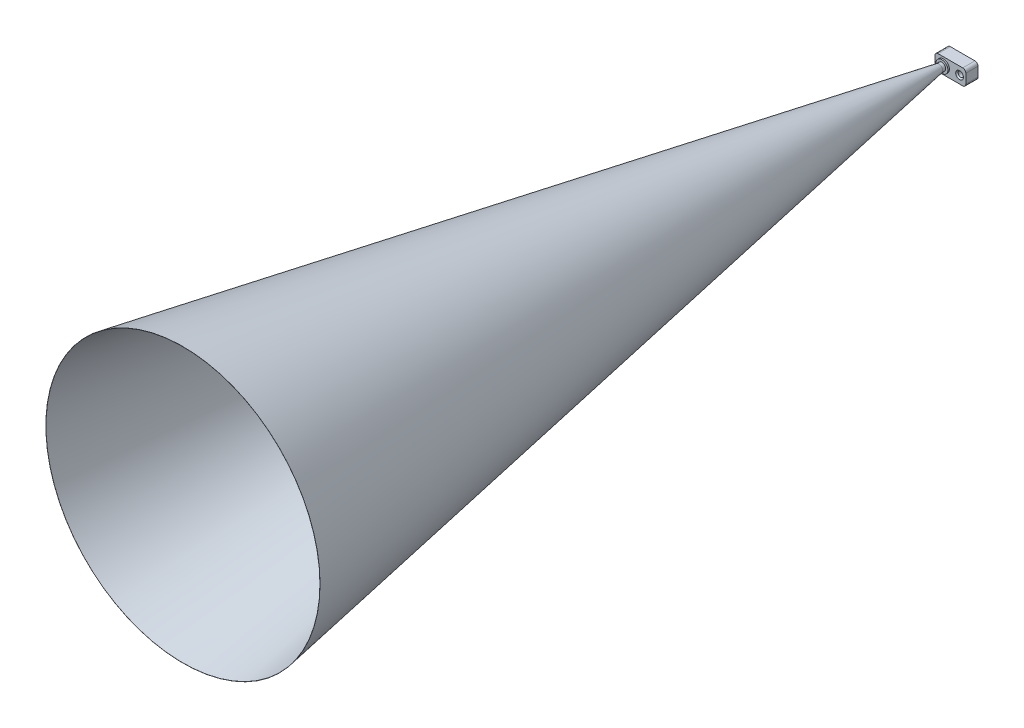
ISO-10303-21;
HEADER;
FILE_DESCRIPTION(('STEP AP214'),'2;1');
FILE_NAME('part.step','',(''),(''),'','','');
FILE_SCHEMA(('AUTOMOTIVE_DESIGN { 1 0 10303 214 1 1 1 1 }'));
ENDSEC;
DATA;
#1=APPLICATION_CONTEXT('core data for automotive mechanical design processes');
#2=APPLICATION_PROTOCOL_DEFINITION('international standard','automotive_design',2000,#1);
#3=PRODUCT_CONTEXT('',#1,'mechanical');
#4=PRODUCT('Part','Part','',(#3));
#5=PRODUCT_RELATED_PRODUCT_CATEGORY('part','',(#4));
#6=PRODUCT_DEFINITION_FORMATION('','',#4);
#7=PRODUCT_DEFINITION_CONTEXT('part definition',#1,'design');
#8=PRODUCT_DEFINITION('design','',#6,#7);
#9=PRODUCT_DEFINITION_SHAPE('','',#8);
#10=(LENGTH_UNIT() NAMED_UNIT(*) SI_UNIT(.MILLI.,.METRE.));
#11=(NAMED_UNIT(*) PLANE_ANGLE_UNIT() SI_UNIT($,.RADIAN.));
#12=(NAMED_UNIT(*) SI_UNIT($,.STERADIAN.) SOLID_ANGLE_UNIT());
#13=UNCERTAINTY_MEASURE_WITH_UNIT(LENGTH_MEASURE(1.E-05),#10,'distance_accuracy_value','');
#14=(GEOMETRIC_REPRESENTATION_CONTEXT(3) GLOBAL_UNCERTAINTY_ASSIGNED_CONTEXT((#13)) GLOBAL_UNIT_ASSIGNED_CONTEXT((#10,
#11,#12)) REPRESENTATION_CONTEXT('',''));
#15=CARTESIAN_POINT('',(0.,0.,0.));
#16=DIRECTION('',(0.,0.,1.));
#17=DIRECTION('',(1.,0.,0.));
#18=AXIS2_PLACEMENT_3D('',#15,#16,#17);
#19=CARTESIAN_POINT('',(7.90594809327857,5.08,10.8712));
#20=DIRECTION('',(0.,0.,1.));
#21=DIRECTION('',(1.,0.,0.));
#22=AXIS2_PLACEMENT_3D('',#19,#20,#21);
#23=PLANE('',#22);
#24=CARTESIAN_POINT('',(5.49999999999999,5.08,10.8712));
#25=DIRECTION('',(0.,0.,-1.));
#26=DIRECTION('',(-1.,0.,0.));
#27=AXIS2_PLACEMENT_3D('',#24,#25,#26);
#28=CIRCLE('',#27,2.40594809327857);
#29=CARTESIAN_POINT('',(7.90594809327857,5.08,10.8712));
#30=VERTEX_POINT('',#29);
#31=EDGE_CURVE('E75',#30,#30,#28,.T.);
#32=ORIENTED_EDGE('',*,*,#31,.F.);
#33=EDGE_LOOP('',(#32));
#34=FACE_BOUND('',#33,.T.);
#35=CARTESIAN_POINT('',(5.49999999999999,5.08,10.8712));
#36=DIRECTION('',(0.,0.,-1.));
#37=DIRECTION('',(-1.,0.,0.));
#38=AXIS2_PLACEMENT_3D('',#35,#36,#37);
#39=CIRCLE('',#38,2.4765);
#40=CARTESIAN_POINT('',(7.97649999999999,5.08,10.8712));
#41=VERTEX_POINT('',#40);
#42=EDGE_CURVE('E11',#41,#41,#39,.T.);
#43=ORIENTED_EDGE('',*,*,#42,.T.);
#44=EDGE_LOOP('',(#43));
#45=FACE_BOUND('',#44,.T.);
#46=ADVANCED_FACE('F59',(#34,#45),#23,.F.);
#47=CARTESIAN_POINT('',(5.49999999999999,5.08,503.275076506104));
#48=DIRECTION('',(0.,0.,1.));
#49=DIRECTION('',(1.,0.,0.));
#50=AXIS2_PLACEMENT_3D('',#47,#48,#49);
#51=CONICAL_SURFACE('',#50,89.3005888334657,0.174532925199434);
#52=CARTESIAN_POINT('',(5.49999999999999,5.08,503.275076506104));
#53=DIRECTION('',(0.,0.,-1.));
#54=DIRECTION('',(-1.,0.,0.));
#55=AXIS2_PLACEMENT_3D('',#52,#53,#54);
#56=CIRCLE('',#55,89.3005888334657);
#57=CARTESIAN_POINT('',(94.8005888334657,5.08,503.275076506104));
#58=VERTEX_POINT('',#57);
#59=EDGE_CURVE('E66',#58,#58,#56,.T.);
#60=CARTESIAN_POINT('',(7.97649999999999,5.08,10.8712));
#61=CARTESIAN_POINT('',(8.88091759201525,5.08,16.0004070469386));
#62=CARTESIAN_POINT('',(9.78533518403051,5.08,21.1296140938771));
#63=CARTESIAN_POINT('',(11.594170368061,5.08,31.3880281877543));
#64=CARTESIAN_POINT('',(12.4985879600763,5.08,36.5172352346929));
#65=CARTESIAN_POINT('',(14.3074231441068,5.08,46.77564932857));
#66=CARTESIAN_POINT('',(15.2118407361221,5.08,51.9048563755086));
#67=CARTESIAN_POINT('',(17.0206759201527,5.08,62.1632704693858));
#68=CARTESIAN_POINT('',(17.9250935121679,5.08,67.2924775163244));
#69=CARTESIAN_POINT('',(19.7339286961985,5.08,77.5508916102016));
#70=CARTESIAN_POINT('',(20.6383462882137,5.08,82.6800986571401));
#71=CARTESIAN_POINT('',(22.4471814722443,5.08,92.9385127510173));
#72=CARTESIAN_POINT('',(23.3515990642595,5.08,98.0677197979559));
#73=CARTESIAN_POINT('',(25.1604342482901,5.08,108.326133891833));
#74=CARTESIAN_POINT('',(26.0648518403053,5.08,113.455340938772));
#75=CARTESIAN_POINT('',(27.8736870243359,5.08,123.713755032649));
#76=CARTESIAN_POINT('',(28.7781046163511,5.08,128.842962079587));
#77=CARTESIAN_POINT('',(30.5869398003817,5.08,139.101376173465));
#78=CARTESIAN_POINT('',(31.4913573923969,5.08,144.230583220403));
#79=CARTESIAN_POINT('',(33.3001925764275,5.08,154.48899731428));
#80=CARTESIAN_POINT('',(34.2046101684427,5.08,159.618204361219));
#81=CARTESIAN_POINT('',(36.0134453524733,5.08,169.876618455096));
#82=CARTESIAN_POINT('',(36.9178629444885,5.08,175.005825502035));
#83=CARTESIAN_POINT('',(38.7266981285191,5.08,185.264239595912));
#84=CARTESIAN_POINT('',(39.6311157205343,5.08,190.39344664285));
#85=CARTESIAN_POINT('',(41.4399509045649,5.08,200.651860736728));
#86=CARTESIAN_POINT('',(42.3443684965801,5.08,205.781067783666));
#87=CARTESIAN_POINT('',(44.1532036806107,5.08,216.039481877543));
#88=CARTESIAN_POINT('',(45.057621272626,5.08,221.168688924482));
#89=CARTESIAN_POINT('',(46.8664564566565,5.08,231.427103018359));
#90=CARTESIAN_POINT('',(47.7708740486718,5.08,236.556310065298));
#91=CARTESIAN_POINT('',(49.5797092327023,5.08,246.814724159175));
#92=CARTESIAN_POINT('',(50.4841268247176,5.08,251.943931206113));
#93=CARTESIAN_POINT('',(52.2929620087481,5.08,262.202345299991));
#94=CARTESIAN_POINT('',(53.1973796007634,5.08,267.331552346929));
#95=CARTESIAN_POINT('',(55.0062147847939,5.08,277.589966440806));
#96=CARTESIAN_POINT('',(55.9106323768092,5.08,282.719173487745));
#97=CARTESIAN_POINT('',(57.7194675608397,5.08,292.977587581622));
#98=CARTESIAN_POINT('',(58.623885152855,5.08,298.106794628561));
#99=CARTESIAN_POINT('',(60.4327203368855,5.08,308.365208722438));
#100=CARTESIAN_POINT('',(61.3371379289008,5.08,313.494415769376));
#101=CARTESIAN_POINT('',(63.1459731129313,5.08,323.752829863254));
#102=CARTESIAN_POINT('',(64.0503907049466,5.08,328.882036910192));
#103=CARTESIAN_POINT('',(65.8592258889771,5.08,339.140451004069));
#104=CARTESIAN_POINT('',(66.7636434809924,5.08,344.269658051008));
#105=CARTESIAN_POINT('',(68.5724786650229,5.08,354.528072144885));
#106=CARTESIAN_POINT('',(69.4768962570382,5.08,359.657279191824));
#107=CARTESIAN_POINT('',(71.2857314410687,5.08,369.915693285701));
#108=CARTESIAN_POINT('',(72.190149033084,5.08,375.044900332639));
#109=CARTESIAN_POINT('',(73.9989842171145,5.08,385.303314426517));
#110=CARTESIAN_POINT('',(74.9034018091298,5.08,390.432521473455));
#111=CARTESIAN_POINT('',(76.7122369931603,5.08,400.690935567332));
#112=CARTESIAN_POINT('',(77.6166545851756,5.08,405.820142614271));
#113=CARTESIAN_POINT('',(79.4254897692061,5.08,416.078556708148));
#114=CARTESIAN_POINT('',(80.3299073612214,5.08,421.207763755087));
#115=CARTESIAN_POINT('',(82.1387425452519,5.08,431.466177848964));
#116=CARTESIAN_POINT('',(83.0431601372672,5.08,436.595384895902));
#117=CARTESIAN_POINT('',(84.8519953212977,5.08,446.85379898978));
#118=CARTESIAN_POINT('',(85.756412913313,5.08,451.983006036718));
#119=CARTESIAN_POINT('',(87.5652480973435,5.08,462.241420130595));
#120=CARTESIAN_POINT('',(88.4696656893588,5.08,467.370627177534));
#121=CARTESIAN_POINT('',(90.2785008733893,5.08,477.629041271411));
#122=CARTESIAN_POINT('',(91.1829184654046,5.08,482.75824831835));
#123=CARTESIAN_POINT('',(92.9917536494351,5.08,493.016662412227));
#124=CARTESIAN_POINT('',(93.8961712414504,5.08,498.145869459165));
#125=CARTESIAN_POINT('',(94.8005888334657,5.08,503.275076506104));
#126=B_SPLINE_CURVE_WITH_KNOTS('',3,(#60,#61,#62,#63,#64,#65,#66,#67,#68,#69,#70,#71,#72,#73,
#74,#75,#76,#77,#78,#79,#80,#81,#82,#83,#84,#85,#86,#87,#88,#89,#90,#91,#92,#93,#94,#95,#96,#97,
#98,#99,#100,#101,#102,#103,#104,#105,#106,#107,#108,#109,#110,#111,#112,#113,#114,#115,#116,
#117,#118,#119,#120,#121,#122,#123,#124,#125),.UNSPECIFIED.,.F.,.F.,(4,2,2,2,2,2,2,2,2,2,2,2,2,
2,2,2,2,2,2,2,2,2,2,2,2,2,2,2,2,2,2,2,4),(0.,15.625,31.25,46.875,62.5,78.125,93.75,109.375,125.,
140.625,156.25,171.875,187.5,203.125,218.75,234.375,250.,265.625,281.25,296.875,312.5,328.125,
343.75,359.375,375.,390.625,406.25,421.875,437.5,453.125,468.75,484.375,500.),.UNSPECIFIED.);
#127=EDGE_CURVE('BSEAM84',#41,#58,#126,.T.);
#128=ORIENTED_EDGE('',*,*,#42,.F.);
#129=ORIENTED_EDGE('',*,*,#59,.T.);
#130=ORIENTED_EDGE('',*,*,#127,.T.);
#131=ORIENTED_EDGE('',*,*,#127,.F.);
#132=EDGE_LOOP('',(#128,#130,#129,#131));
#133=FACE_BOUND('',#132,.T.);
#134=ADVANCED_FACE('F84',(#133),#51,.T.);
#135=CARTESIAN_POINT('',(94.8005888334657,5.08,503.275076506104));
#136=DIRECTION('',(0.,0.,-1.));
#137=DIRECTION('',(-1.,0.,0.));
#138=AXIS2_PLACEMENT_3D('',#135,#136,#137);
#139=PLANE('',#138);
#140=ORIENTED_EDGE('',*,*,#59,.F.);
#141=EDGE_LOOP('',(#140));
#142=FACE_BOUND('',#141,.T.);
#143=CARTESIAN_POINT('',(5.49999999999999,5.08,503.275076506104));
#144=DIRECTION('',(0.,0.,-1.));
#145=DIRECTION('',(-1.,0.,0.));
#146=AXIS2_PLACEMENT_3D('',#143,#144,#145);
#147=CIRCLE('',#146,89.2300369267443);
#148=CARTESIAN_POINT('',(94.7300369267443,5.08,503.275076506104));
#149=VERTEX_POINT('',#148);
#150=EDGE_CURVE('E71',#149,#149,#147,.T.);
#151=ORIENTED_EDGE('',*,*,#150,.T.);
#152=EDGE_LOOP('',(#151));
#153=FACE_BOUND('',#152,.T.);
#154=ADVANCED_FACE('F89',(#142,#153),#139,.F.);
#155=CARTESIAN_POINT('',(5.49999999999999,5.08,10.8712));
#156=DIRECTION('',(0.,0.,1.));
#157=DIRECTION('',(1.,0.,0.));
#158=AXIS2_PLACEMENT_3D('',#155,#156,#157);
#159=CONICAL_SURFACE('',#158,2.40594809327857,0.174532925199434);
#160=CARTESIAN_POINT('',(94.7300369267443,5.08,503.275076506104));
#161=CARTESIAN_POINT('',(93.825619334729,5.08,498.145869459165));
#162=CARTESIAN_POINT('',(92.9212017427137,5.08,493.016662412227));
#163=CARTESIAN_POINT('',(91.1123665586832,5.08,482.75824831835));
#164=CARTESIAN_POINT('',(90.2079489666679,5.08,477.629041271411));
#165=CARTESIAN_POINT('',(88.3991137826374,5.08,467.370627177534));
#166=CARTESIAN_POINT('',(87.4946961906221,5.08,462.241420130595));
#167=CARTESIAN_POINT('',(85.6858610065916,5.08,451.983006036718));
#168=CARTESIAN_POINT('',(84.7814434145763,5.08,446.85379898978));
#169=CARTESIAN_POINT('',(82.9726082305458,5.08,436.595384895902));
#170=CARTESIAN_POINT('',(82.0681906385305,5.08,431.466177848964));
#171=CARTESIAN_POINT('',(80.2593554545,5.08,421.207763755087));
#172=CARTESIAN_POINT('',(79.3549378624847,5.08,416.078556708148));
#173=CARTESIAN_POINT('',(77.5461026784542,5.08,405.820142614271));
#174=CARTESIAN_POINT('',(76.6416850864389,5.08,400.690935567332));
#175=CARTESIAN_POINT('',(74.8328499024084,5.08,390.432521473455));
#176=CARTESIAN_POINT('',(73.9284323103931,5.08,385.303314426517));
#177=CARTESIAN_POINT('',(72.1195971263626,5.08,375.044900332639));
#178=CARTESIAN_POINT('',(71.2151795343473,5.08,369.915693285701));
#179=CARTESIAN_POINT('',(69.4063443503168,5.08,359.657279191824));
#180=CARTESIAN_POINT('',(68.5019267583015,5.08,354.528072144885));
#181=CARTESIAN_POINT('',(66.693091574271,5.08,344.269658051008));
#182=CARTESIAN_POINT('',(65.7886739822557,5.08,339.140451004069));
#183=CARTESIAN_POINT('',(63.9798387982252,5.08,328.882036910192));
#184=CARTESIAN_POINT('',(63.0754212062099,5.08,323.752829863254));
#185=CARTESIAN_POINT('',(61.2665860221794,5.08,313.494415769376));
#186=CARTESIAN_POINT('',(60.3621684301641,5.08,308.365208722438));
#187=CARTESIAN_POINT('',(58.5533332461336,5.08,298.106794628561));
#188=CARTESIAN_POINT('',(57.6489156541183,5.08,292.977587581622));
#189=CARTESIAN_POINT('',(55.8400804700878,5.08,282.719173487745));
#190=CARTESIAN_POINT('',(54.9356628780725,5.08,277.589966440806));
#191=CARTESIAN_POINT('',(53.126827694042,5.08,267.331552346929));
#192=CARTESIAN_POINT('',(52.2224101020267,5.08,262.202345299991));
#193=CARTESIAN_POINT('',(50.4135749179961,5.08,251.943931206113));
#194=CARTESIAN_POINT('',(49.5091573259809,5.08,246.814724159175));
#195=CARTESIAN_POINT('',(47.7003221419504,5.08,236.556310065298));
#196=CARTESIAN_POINT('',(46.7959045499351,5.08,231.427103018359));
#197=CARTESIAN_POINT('',(44.9870693659046,5.08,221.168688924482));
#198=CARTESIAN_POINT('',(44.0826517738893,5.08,216.039481877543));
#199=CARTESIAN_POINT('',(42.2738165898587,5.08,205.781067783666));
#200=CARTESIAN_POINT('',(41.3693989978435,5.08,200.651860736728));
#201=CARTESIAN_POINT('',(39.5605638138129,5.08,190.39344664285));
#202=CARTESIAN_POINT('',(38.6561462217977,5.08,185.264239595912));
#203=CARTESIAN_POINT('',(36.8473110377671,5.08,175.005825502035));
#204=CARTESIAN_POINT('',(35.9428934457519,5.08,169.876618455096));
#205=CARTESIAN_POINT('',(34.1340582617213,5.08,159.618204361219));
#206=CARTESIAN_POINT('',(33.2296406697061,5.08,154.48899731428));
#207=CARTESIAN_POINT('',(31.4208054856755,5.08,144.230583220403));
#208=CARTESIAN_POINT('',(30.5163878936603,5.08,139.101376173465));
#209=CARTESIAN_POINT('',(28.7075527096297,5.08,128.842962079587));
#210=CARTESIAN_POINT('',(27.8031351176145,5.08,123.713755032649));
#211=CARTESIAN_POINT('',(25.9942999335839,5.08,113.455340938772));
#212=CARTESIAN_POINT('',(25.0898823415687,5.08,108.326133891833));
#213=CARTESIAN_POINT('',(23.2810471575381,5.08,98.0677197979559));
#214=CARTESIAN_POINT('',(22.3766295655229,5.08,92.9385127510173));
#215=CARTESIAN_POINT('',(20.5677943814923,5.08,82.6800986571401));
#216=CARTESIAN_POINT('',(19.663376789477,5.08,77.5508916102016));
#217=CARTESIAN_POINT('',(17.8545416054465,5.08,67.2924775163244));
#218=CARTESIAN_POINT('',(16.9501240134312,5.08,62.1632704693858));
#219=CARTESIAN_POINT('',(15.1412888294007,5.08,51.9048563755087));
#220=CARTESIAN_POINT('',(14.2368712373854,5.08,46.7756493285701));
#221=CARTESIAN_POINT('',(12.4280360533549,5.08,36.5172352346929));
#222=CARTESIAN_POINT('',(11.5236184613396,5.08,31.3880281877543));
#223=CARTESIAN_POINT('',(9.71478327730911,5.08,21.1296140938772));
#224=CARTESIAN_POINT('',(8.81036568529384,5.08,16.0004070469386));
#225=CARTESIAN_POINT('',(7.90594809327857,5.08,10.8712));
#226=B_SPLINE_CURVE_WITH_KNOTS('',3,(#160,#161,#162,#163,#164,#165,#166,#167,#168,#169,#170,
#171,#172,#173,#174,#175,#176,#177,#178,#179,#180,#181,#182,#183,#184,#185,#186,#187,#188,#189,
#190,#191,#192,#193,#194,#195,#196,#197,#198,#199,#200,#201,#202,#203,#204,#205,#206,#207,#208,
#209,#210,#211,#212,#213,#214,#215,#216,#217,#218,#219,#220,#221,#222,#223,#224,#225),
.UNSPECIFIED.,.F.,.F.,(4,2,2,2,2,2,2,2,2,2,2,2,2,2,2,2,2,2,2,2,2,2,2,2,2,2,2,2,2,2,2,2,4),(0.,
15.625,31.2499999999999,46.8749999999999,62.5,78.125,93.7499999999999,109.375,125.,140.625,
156.25,171.875,187.5,203.125,218.75,234.375,250.,265.625,281.25,296.875,312.5,328.125,343.75,
359.375,375.,390.625,406.25,421.875,437.5,453.125,468.75,484.375,500.),.UNSPECIFIED.);
#227=EDGE_CURVE('BSEAM81',#149,#30,#226,.T.);
#228=ORIENTED_EDGE('',*,*,#150,.F.);
#229=ORIENTED_EDGE('',*,*,#31,.T.);
#230=ORIENTED_EDGE('',*,*,#227,.T.);
#231=ORIENTED_EDGE('',*,*,#227,.F.);
#232=EDGE_LOOP('',(#228,#230,#229,#231));
#233=FACE_BOUND('',#232,.T.);
#234=ADVANCED_FACE('F81',(#233),#159,.F.);
#235=CLOSED_SHELL('',(#46,#134,#154,#234));
#236=MANIFOLD_SOLID_BREP('B2',#235);
#237=CARTESIAN_POINT('',(0.,0.,7.9502));
#238=DIRECTION('',(1.,0.,0.));
#239=DIRECTION('',(0.,1.,0.));
#240=AXIS2_PLACEMENT_3D('',#237,#238,#239);
#241=PLANE('',#240);
#242=DIRECTION('',(0.,-1.,0.));
#243=VECTOR('',#242,1.);
#244=CARTESIAN_POINT('',(0.,0.,0.));
#245=LINE('',#244,#243);
#246=CARTESIAN_POINT('',(0.,8.16,0.));
#247=VERTEX_POINT('',#246);
#248=CARTESIAN_POINT('',(0.,2.,0.));
#249=VERTEX_POINT('',#248);
#250=EDGE_CURVE('E257',#247,#249,#245,.T.);
#251=ORIENTED_EDGE('',*,*,#250,.T.);
#252=DIRECTION('',(0.,0.,-1.));
#253=VECTOR('',#252,1.);
#254=CARTESIAN_POINT('',(0.,2.,7.9502));
#255=LINE('',#254,#253);
#256=CARTESIAN_POINT('',(0.,2.,7.9502));
#257=VERTEX_POINT('',#256);
#258=EDGE_CURVE('E233',#249,#257,#255,.F.);
#259=ORIENTED_EDGE('',*,*,#258,.T.);
#260=DIRECTION('',(0.,-1.,0.));
#261=VECTOR('',#260,1.);
#262=CARTESIAN_POINT('',(0.,0.,7.9502));
#263=LINE('',#262,#261);
#264=CARTESIAN_POINT('',(0.,8.16,7.9502));
#265=VERTEX_POINT('',#264);
#266=EDGE_CURVE('E270',#265,#257,#263,.T.);
#267=ORIENTED_EDGE('',*,*,#266,.F.);
#268=DIRECTION('',(0.,0.,-1.));
#269=VECTOR('',#268,1.);
#270=CARTESIAN_POINT('',(0.,8.16,7.9502));
#271=LINE('',#270,#269);
#272=EDGE_CURVE('E238',#265,#247,#271,.T.);
#273=ORIENTED_EDGE('',*,*,#272,.T.);
#274=EDGE_LOOP('',(#251,#259,#267,#273));
#275=FACE_BOUND('',#274,.T.);
#276=ADVANCED_FACE('F152',(#275),#241,.F.);
#277=CARTESIAN_POINT('',(0.,0.,7.9502));
#278=DIRECTION('',(0.,1.,0.));
#279=DIRECTION('',(0.,0.,1.));
#280=AXIS2_PLACEMENT_3D('',#277,#278,#279);
#281=PLANE('',#280);
#282=DIRECTION('',(1.,0.,0.));
#283=VECTOR('',#282,1.);
#284=CARTESIAN_POINT('',(0.,0.,7.9502));
#285=LINE('',#284,#283);
#286=CARTESIAN_POINT('',(2.,0.,7.9502));
#287=VERTEX_POINT('',#286);
#288=CARTESIAN_POINT('',(18.066,0.,7.9502));
#289=VERTEX_POINT('',#288);
#290=EDGE_CURVE('E248',#287,#289,#285,.T.);
#291=ORIENTED_EDGE('',*,*,#290,.F.);
#292=DIRECTION('',(0.,0.,-1.));
#293=VECTOR('',#292,1.);
#294=CARTESIAN_POINT('',(2.,0.,7.9502));
#295=LINE('',#294,#293);
#296=CARTESIAN_POINT('',(2.,0.,0.));
#297=VERTEX_POINT('',#296);
#298=EDGE_CURVE('E232',#287,#297,#295,.T.);
#299=ORIENTED_EDGE('',*,*,#298,.T.);
#300=DIRECTION('',(1.,0.,0.));
#301=VECTOR('',#300,1.);
#302=CARTESIAN_POINT('',(0.,0.,0.));
#303=LINE('',#302,#301);
#304=CARTESIAN_POINT('',(18.066,0.,0.));
#305=VERTEX_POINT('',#304);
#306=EDGE_CURVE('E245',#297,#305,#303,.T.);
#307=ORIENTED_EDGE('',*,*,#306,.T.);
#308=DIRECTION('',(0.,0.,-1.));
#309=VECTOR('',#308,1.);
#310=CARTESIAN_POINT('',(18.066,0.,7.9502));
#311=LINE('',#310,#309);
#312=EDGE_CURVE('E250',#305,#289,#311,.F.);
#313=ORIENTED_EDGE('',*,*,#312,.T.);
#314=EDGE_LOOP('',(#291,#299,#307,#313));
#315=FACE_BOUND('',#314,.T.);
#316=ADVANCED_FACE('F244',(#315),#281,.F.);
#317=CARTESIAN_POINT('',(20.066,0.,7.9502));
#318=DIRECTION('',(-1.,0.,0.));
#319=DIRECTION('',(0.,-1.,0.));
#320=AXIS2_PLACEMENT_3D('',#317,#318,#319);
#321=PLANE('',#320);
#322=DIRECTION('',(0.,1.,0.));
#323=VECTOR('',#322,1.);
#324=CARTESIAN_POINT('',(20.066,0.,7.9502));
#325=LINE('',#324,#323);
#326=CARTESIAN_POINT('',(20.066,2.,7.9502));
#327=VERTEX_POINT('',#326);
#328=CARTESIAN_POINT('',(20.066,8.16,7.9502));
#329=VERTEX_POINT('',#328);
#330=EDGE_CURVE('E308',#327,#329,#325,.T.);
#331=ORIENTED_EDGE('',*,*,#330,.F.);
#332=DIRECTION('',(0.,0.,-1.));
#333=VECTOR('',#332,1.);
#334=CARTESIAN_POINT('',(20.066,2.,7.9502));
#335=LINE('',#334,#333);
#336=CARTESIAN_POINT('',(20.066,2.,0.));
#337=VERTEX_POINT('',#336);
#338=EDGE_CURVE('E57',#327,#337,#335,.T.);
#339=ORIENTED_EDGE('',*,*,#338,.T.);
#340=DIRECTION('',(0.,1.,0.));
#341=VECTOR('',#340,1.);
#342=CARTESIAN_POINT('',(20.066,0.,0.));
#343=LINE('',#342,#341);
#344=CARTESIAN_POINT('',(20.066,8.16,0.));
#345=VERTEX_POINT('',#344);
#346=EDGE_CURVE('E256',#337,#345,#343,.T.);
#347=ORIENTED_EDGE('',*,*,#346,.T.);
#348=DIRECTION('',(0.,0.,-1.));
#349=VECTOR('',#348,1.);
#350=CARTESIAN_POINT('',(20.066,8.16,7.9502));
#351=LINE('',#350,#349);
#352=EDGE_CURVE('E161',#345,#329,#351,.F.);
#353=ORIENTED_EDGE('',*,*,#352,.T.);
#354=EDGE_LOOP('',(#331,#339,#347,#353));
#355=FACE_BOUND('',#354,.T.);
#356=ADVANCED_FACE('F307',(#355),#321,.F.);
#357=CARTESIAN_POINT('',(0.,10.16,7.9502));
#358=DIRECTION('',(0.,-1.,0.));
#359=DIRECTION('',(0.,0.,-1.));
#360=AXIS2_PLACEMENT_3D('',#357,#358,#359);
#361=PLANE('',#360);
#362=DIRECTION('',(-1.,0.,0.));
#363=VECTOR('',#362,1.);
#364=CARTESIAN_POINT('',(0.,10.16,0.));
#365=LINE('',#364,#363);
#366=CARTESIAN_POINT('',(18.066,10.16,0.));
#367=VERTEX_POINT('',#366);
#368=CARTESIAN_POINT('',(1.99999999999999,10.16,0.));
#369=VERTEX_POINT('',#368);
#370=EDGE_CURVE('E262',#367,#369,#365,.T.);
#371=ORIENTED_EDGE('',*,*,#370,.T.);
#372=DIRECTION('',(0.,0.,-1.));
#373=VECTOR('',#372,1.);
#374=CARTESIAN_POINT('',(1.99999999999999,10.16,7.9502));
#375=LINE('',#374,#373);
#376=CARTESIAN_POINT('',(1.99999999999999,10.16,7.9502));
#377=VERTEX_POINT('',#376);
#378=EDGE_CURVE('E168',#369,#377,#375,.F.);
#379=ORIENTED_EDGE('',*,*,#378,.T.);
#380=DIRECTION('',(-1.,0.,0.));
#381=VECTOR('',#380,1.);
#382=CARTESIAN_POINT('',(0.,10.16,7.9502));
#383=LINE('',#382,#381);
#384=CARTESIAN_POINT('',(18.066,10.16,7.9502));
#385=VERTEX_POINT('',#384);
#386=EDGE_CURVE('E315',#385,#377,#383,.T.);
#387=ORIENTED_EDGE('',*,*,#386,.F.);
#388=DIRECTION('',(0.,0.,-1.));
#389=VECTOR('',#388,1.);
#390=CARTESIAN_POINT('',(18.066,10.16,7.9502));
#391=LINE('',#390,#389);
#392=EDGE_CURVE('E298',#385,#367,#391,.T.);
#393=ORIENTED_EDGE('',*,*,#392,.T.);
#394=EDGE_LOOP('',(#371,#379,#387,#393));
#395=FACE_BOUND('',#394,.T.);
#396=ADVANCED_FACE('F319',(#395),#361,.F.);
#397=CARTESIAN_POINT('',(0.,0.,7.9502));
#398=DIRECTION('',(0.,0.,-1.));
#399=DIRECTION('',(-1.,0.,0.));
#400=AXIS2_PLACEMENT_3D('',#397,#398,#399);
#401=PLANE('',#400);
#402=CARTESIAN_POINT('',(16.,5.08,7.9502));
#403=DIRECTION('',(0.,0.,1.));
#404=DIRECTION('',(1.,0.,0.));
#405=AXIS2_PLACEMENT_3D('',#402,#403,#404);
#406=CIRCLE('',#405,2.5);
#407=CARTESIAN_POINT('',(18.5,5.08,7.9502));
#408=VERTEX_POINT('',#407);
#409=EDGE_CURVE('E356',#408,#408,#406,.T.);
#410=ORIENTED_EDGE('',*,*,#409,.F.);
#411=EDGE_LOOP('',(#410));
#412=FACE_BOUND('',#411,.T.);
#413=CARTESIAN_POINT('',(5.49999999999999,5.08,7.9502));
#414=DIRECTION('',(0.,0.,1.));
#415=DIRECTION('',(1.,0.,0.));
#416=AXIS2_PLACEMENT_3D('',#413,#414,#415);
#417=CIRCLE('',#416,3.8862);
#418=CARTESIAN_POINT('',(9.38619999999999,5.08,7.9502));
#419=VERTEX_POINT('',#418);
#420=EDGE_CURVE('E330',#419,#419,#417,.T.);
#421=ORIENTED_EDGE('',*,*,#420,.F.);
#422=EDGE_LOOP('',(#421));
#423=FACE_BOUND('',#422,.T.);
#424=ORIENTED_EDGE('',*,*,#266,.T.);
#425=CARTESIAN_POINT('',(2.,2.,7.9502));
#426=DIRECTION('',(0.,0.,-1.));
#427=DIRECTION('',(-1.,0.,0.));
#428=AXIS2_PLACEMENT_3D('',#425,#426,#427);
#429=CIRCLE('',#428,2.);
#430=EDGE_CURVE('E296',#257,#287,#429,.F.);
#431=ORIENTED_EDGE('',*,*,#430,.T.);
#432=ORIENTED_EDGE('',*,*,#290,.T.);
#433=CARTESIAN_POINT('',(18.066,2.,7.9502));
#434=DIRECTION('',(0.,0.,-1.));
#435=DIRECTION('',(-1.,0.,0.));
#436=AXIS2_PLACEMENT_3D('',#433,#434,#435);
#437=CIRCLE('',#436,2.);
#438=EDGE_CURVE('E291',#289,#327,#437,.F.);
#439=ORIENTED_EDGE('',*,*,#438,.T.);
#440=ORIENTED_EDGE('',*,*,#330,.T.);
#441=CARTESIAN_POINT('',(18.066,8.16,7.9502));
#442=DIRECTION('',(0.,0.,-1.));
#443=DIRECTION('',(-1.,0.,0.));
#444=AXIS2_PLACEMENT_3D('',#441,#442,#443);
#445=CIRCLE('',#444,2.);
#446=EDGE_CURVE('E178',#329,#385,#445,.F.);
#447=ORIENTED_EDGE('',*,*,#446,.T.);
#448=ORIENTED_EDGE('',*,*,#386,.T.);
#449=CARTESIAN_POINT('',(1.99999999999999,8.16,7.9502));
#450=DIRECTION('',(0.,0.,-1.));
#451=DIRECTION('',(-1.,0.,0.));
#452=AXIS2_PLACEMENT_3D('',#449,#450,#451);
#453=CIRCLE('',#452,2.);
#454=EDGE_CURVE('E294',#377,#265,#453,.F.);
#455=ORIENTED_EDGE('',*,*,#454,.T.);
#456=EDGE_LOOP('',(#424,#431,#432,#439,#440,#447,#448,#455));
#457=FACE_BOUND('',#456,.T.);
#458=ADVANCED_FACE('F312',(#412,#423,#457),#401,.F.);
#459=CARTESIAN_POINT('',(0.,0.,0.));
#460=DIRECTION('',(0.,0.,-1.));
#461=DIRECTION('',(-1.,0.,0.));
#462=AXIS2_PLACEMENT_3D('',#459,#460,#461);
#463=PLANE('',#462);
#464=CARTESIAN_POINT('',(16.,5.08,0.));
#465=DIRECTION('',(0.,0.,1.));
#466=DIRECTION('',(1.,0.,0.));
#467=AXIS2_PLACEMENT_3D('',#464,#465,#466);
#468=CIRCLE('',#467,1.7);
#469=CARTESIAN_POINT('',(17.7,5.08,0.));
#470=VERTEX_POINT('',#469);
#471=EDGE_CURVE('E345',#470,#470,#468,.T.);
#472=ORIENTED_EDGE('',*,*,#471,.T.);
#473=EDGE_LOOP('',(#472));
#474=FACE_BOUND('',#473,.T.);
#475=ORIENTED_EDGE('',*,*,#306,.F.);
#476=CARTESIAN_POINT('',(2.,2.,0.));
#477=DIRECTION('',(0.,0.,-1.));
#478=DIRECTION('',(-1.,0.,0.));
#479=AXIS2_PLACEMENT_3D('',#476,#477,#478);
#480=CIRCLE('',#479,2.);
#481=EDGE_CURVE('E228',#297,#249,#480,.T.);
#482=ORIENTED_EDGE('',*,*,#481,.T.);
#483=ORIENTED_EDGE('',*,*,#250,.F.);
#484=CARTESIAN_POINT('',(1.99999999999999,8.16,0.));
#485=DIRECTION('',(0.,0.,-1.));
#486=DIRECTION('',(-1.,0.,0.));
#487=AXIS2_PLACEMENT_3D('',#484,#485,#486);
#488=CIRCLE('',#487,2.);
#489=EDGE_CURVE('E239',#247,#369,#488,.T.);
#490=ORIENTED_EDGE('',*,*,#489,.T.);
#491=ORIENTED_EDGE('',*,*,#370,.F.);
#492=CARTESIAN_POINT('',(18.066,8.16,0.));
#493=DIRECTION('',(0.,0.,-1.));
#494=DIRECTION('',(-1.,0.,0.));
#495=AXIS2_PLACEMENT_3D('',#492,#493,#494);
#496=CIRCLE('',#495,2.);
#497=EDGE_CURVE('E249',#367,#345,#496,.T.);
#498=ORIENTED_EDGE('',*,*,#497,.T.);
#499=ORIENTED_EDGE('',*,*,#346,.F.);
#500=CARTESIAN_POINT('',(18.066,2.,0.));
#501=DIRECTION('',(0.,0.,-1.));
#502=DIRECTION('',(-1.,0.,0.));
#503=AXIS2_PLACEMENT_3D('',#500,#501,#502);
#504=CIRCLE('',#503,2.);
#505=EDGE_CURVE('E254',#337,#305,#504,.T.);
#506=ORIENTED_EDGE('',*,*,#505,.T.);
#507=EDGE_LOOP('',(#475,#482,#483,#490,#491,#498,#499,#506));
#508=FACE_BOUND('',#507,.T.);
#509=ADVANCED_FACE('F252',(#474,#508),#463,.T.);
#510=CARTESIAN_POINT('',(5.49999999999999,5.08,8.9408));
#511=DIRECTION('',(0.,0.,-1.));
#512=DIRECTION('',(-1.,0.,0.));
#513=AXIS2_PLACEMENT_3D('',#510,#511,#512);
#514=CYLINDRICAL_SURFACE('',#513,3.8862);
#515=CARTESIAN_POINT('',(5.49999999999999,5.08,8.9408));
#516=DIRECTION('',(0.,0.,1.));
#517=DIRECTION('',(1.,0.,0.));
#518=AXIS2_PLACEMENT_3D('',#515,#516,#517);
#519=CIRCLE('',#518,3.8862);
#520=CARTESIAN_POINT('',(9.38619999999999,5.08,8.9408));
#521=VERTEX_POINT('',#520);
#522=EDGE_CURVE('E264',#521,#521,#519,.T.);
#523=ORIENTED_EDGE('',*,*,#522,.F.);
#524=EDGE_LOOP('',(#523));
#525=FACE_BOUND('',#524,.T.);
#526=ORIENTED_EDGE('',*,*,#420,.T.);
#527=EDGE_LOOP('',(#526));
#528=FACE_BOUND('',#527,.T.);
#529=ADVANCED_FACE('F373',(#525,#528),#514,.T.);
#530=CARTESIAN_POINT('',(5.49999999999999,5.08,8.9408));
#531=DIRECTION('',(0.,0.,1.));
#532=DIRECTION('',(1.,0.,0.));
#533=AXIS2_PLACEMENT_3D('',#530,#531,#532);
#534=PLANE('',#533);
#535=CARTESIAN_POINT('',(5.49999999999999,5.08,8.9408));
#536=DIRECTION('',(0.,0.,1.));
#537=DIRECTION('',(1.,0.,0.));
#538=AXIS2_PLACEMENT_3D('',#535,#536,#537);
#539=CIRCLE('',#538,2.4765);
#540=CARTESIAN_POINT('',(7.97649999999999,5.08,8.9408));
#541=VERTEX_POINT('',#540);
#542=EDGE_CURVE('E276',#541,#541,#539,.T.);
#543=ORIENTED_EDGE('',*,*,#542,.F.);
#544=EDGE_LOOP('',(#543));
#545=FACE_BOUND('',#544,.T.);
#546=ORIENTED_EDGE('',*,*,#522,.T.);
#547=EDGE_LOOP('',(#546));
#548=FACE_BOUND('',#547,.T.);
#549=ADVANCED_FACE('F444',(#545,#548),#534,.T.);
#550=CARTESIAN_POINT('',(5.49999999999999,5.08,13.1572));
#551=DIRECTION('',(0.,0.,-1.));
#552=DIRECTION('',(-1.,0.,0.));
#553=AXIS2_PLACEMENT_3D('',#550,#551,#552);
#554=CYLINDRICAL_SURFACE('',#553,2.4765);
#555=CARTESIAN_POINT('',(5.49999999999999,5.08,10.8712));
#556=DIRECTION('',(0.,0.,1.));
#557=DIRECTION('',(1.,0.,0.));
#558=AXIS2_PLACEMENT_3D('',#555,#556,#557);
#559=CIRCLE('',#558,2.4765);
#560=CARTESIAN_POINT('',(7.97649999999999,5.08,10.8712));
#561=VERTEX_POINT('',#560);
#562=EDGE_CURVE('E275',#561,#561,#559,.F.);
#563=ORIENTED_EDGE('',*,*,#562,.T.);
#564=EDGE_LOOP('',(#563));
#565=FACE_BOUND('',#564,.T.);
#566=ORIENTED_EDGE('',*,*,#542,.T.);
#567=EDGE_LOOP('',(#566));
#568=FACE_BOUND('',#567,.T.);
#569=ADVANCED_FACE('F435',(#565,#568),#554,.T.);
#570=CARTESIAN_POINT('',(5.49999999999999,5.08,13.1572));
#571=DIRECTION('',(0.,0.,1.));
#572=DIRECTION('',(1.,0.,0.));
#573=AXIS2_PLACEMENT_3D('',#570,#571,#572);
#574=PLANE('',#573);
#575=CARTESIAN_POINT('',(5.49999999999999,5.08,13.1572));
#576=DIRECTION('',(0.,0.,1.));
#577=DIRECTION('',(1.,0.,0.));
#578=AXIS2_PLACEMENT_3D('',#575,#576,#577);
#579=CIRCLE('',#578,0.190500000000001);
#580=CARTESIAN_POINT('',(5.69049999999999,5.08,13.1572));
#581=VERTEX_POINT('',#580);
#582=EDGE_CURVE('E271',#581,#581,#579,.T.);
#583=ORIENTED_EDGE('',*,*,#582,.T.);
#584=EDGE_LOOP('',(#583));
#585=FACE_BOUND('',#584,.T.);
#586=ADVANCED_FACE('F430',(#585),#574,.T.);
#587=CARTESIAN_POINT('',(16.,5.08,7.9502));
#588=DIRECTION('',(0.,0.,1.));
#589=DIRECTION('',(1.,0.,0.));
#590=AXIS2_PLACEMENT_3D('',#587,#588,#589);
#591=CYLINDRICAL_SURFACE('',#590,1.7);
#592=ORIENTED_EDGE('',*,*,#471,.F.);
#593=EDGE_LOOP('',(#592));
#594=FACE_BOUND('',#593,.T.);
#595=CARTESIAN_POINT('',(16.,5.08,7.1502));
#596=DIRECTION('',(0.,0.,1.));
#597=DIRECTION('',(1.,0.,0.));
#598=AXIS2_PLACEMENT_3D('',#595,#596,#597);
#599=CIRCLE('',#598,1.7);
#600=CARTESIAN_POINT('',(17.7,5.08,7.1502));
#601=VERTEX_POINT('',#600);
#602=EDGE_CURVE('E351',#601,#601,#599,.T.);
#603=ORIENTED_EDGE('',*,*,#602,.T.);
#604=EDGE_LOOP('',(#603));
#605=FACE_BOUND('',#604,.T.);
#606=ADVANCED_FACE('F434',(#594,#605),#591,.F.);
#607=CARTESIAN_POINT('',(16.,5.08,7.9502));
#608=DIRECTION('',(0.,0.,1.));
#609=DIRECTION('',(1.,0.,0.));
#610=AXIS2_PLACEMENT_3D('',#607,#608,#609);
#611=CONICAL_SURFACE('',#610,2.5,0.785398163397447);
#612=ORIENTED_EDGE('',*,*,#602,.F.);
#613=EDGE_LOOP('',(#612));
#614=FACE_BOUND('',#613,.T.);
#615=ORIENTED_EDGE('',*,*,#409,.T.);
#616=EDGE_LOOP('',(#615));
#617=FACE_BOUND('',#616,.T.);
#618=ADVANCED_FACE('F363',(#614,#617),#611,.F.);
#619=CARTESIAN_POINT('',(5.49999999999999,5.08,10.8712));
#620=DIRECTION('',(0.,0.,1.));
#621=DIRECTION('',(1.,0.,0.));
#622=AXIS2_PLACEMENT_3D('',#619,#620,#621);
#623=DEGENERATE_TOROIDAL_SURFACE('',#622,0.190500000000001,2.286,.T.);
#624=ORIENTED_EDGE('',*,*,#562,.F.);
#625=EDGE_LOOP('',(#624));
#626=FACE_BOUND('',#625,.T.);
#627=ORIENTED_EDGE('',*,*,#582,.F.);
#628=EDGE_LOOP('',(#627));
#629=FACE_BOUND('',#628,.T.);
#630=ADVANCED_FACE('F386',(#626,#629),#623,.T.);
#631=CARTESIAN_POINT('',(2.,2.,7.9502));
#632=DIRECTION('',(0.,0.,-1.));
#633=DIRECTION('',(-1.,0.,0.));
#634=AXIS2_PLACEMENT_3D('',#631,#632,#633);
#635=CYLINDRICAL_SURFACE('',#634,2.);
#636=ORIENTED_EDGE('',*,*,#430,.F.);
#637=ORIENTED_EDGE('',*,*,#258,.F.);
#638=ORIENTED_EDGE('',*,*,#481,.F.);
#639=ORIENTED_EDGE('',*,*,#298,.F.);
#640=EDGE_LOOP('',(#636,#637,#638,#639));
#641=FACE_BOUND('',#640,.T.);
#642=ADVANCED_FACE('F231',(#641),#635,.T.);
#643=CARTESIAN_POINT('',(1.99999999999999,8.16,7.9502));
#644=DIRECTION('',(0.,0.,-1.));
#645=DIRECTION('',(-1.,0.,0.));
#646=AXIS2_PLACEMENT_3D('',#643,#644,#645);
#647=CYLINDRICAL_SURFACE('',#646,2.);
#648=ORIENTED_EDGE('',*,*,#454,.F.);
#649=ORIENTED_EDGE('',*,*,#378,.F.);
#650=ORIENTED_EDGE('',*,*,#489,.F.);
#651=ORIENTED_EDGE('',*,*,#272,.F.);
#652=EDGE_LOOP('',(#648,#649,#650,#651));
#653=FACE_BOUND('',#652,.T.);
#654=ADVANCED_FACE('F323',(#653),#647,.T.);
#655=CARTESIAN_POINT('',(18.066,2.,7.9502));
#656=DIRECTION('',(0.,0.,-1.));
#657=DIRECTION('',(-1.,0.,0.));
#658=AXIS2_PLACEMENT_3D('',#655,#656,#657);
#659=CYLINDRICAL_SURFACE('',#658,2.);
#660=ORIENTED_EDGE('',*,*,#438,.F.);
#661=ORIENTED_EDGE('',*,*,#312,.F.);
#662=ORIENTED_EDGE('',*,*,#505,.F.);
#663=ORIENTED_EDGE('',*,*,#338,.F.);
#664=EDGE_LOOP('',(#660,#661,#662,#663));
#665=FACE_BOUND('',#664,.T.);
#666=ADVANCED_FACE('F393',(#665),#659,.T.);
#667=CARTESIAN_POINT('',(18.066,8.16,7.9502));
#668=DIRECTION('',(0.,0.,-1.));
#669=DIRECTION('',(-1.,0.,0.));
#670=AXIS2_PLACEMENT_3D('',#667,#668,#669);
#671=CYLINDRICAL_SURFACE('',#670,2.);
#672=ORIENTED_EDGE('',*,*,#446,.F.);
#673=ORIENTED_EDGE('',*,*,#352,.F.);
#674=ORIENTED_EDGE('',*,*,#497,.F.);
#675=ORIENTED_EDGE('',*,*,#392,.F.);
#676=EDGE_LOOP('',(#672,#673,#674,#675));
#677=FACE_BOUND('',#676,.T.);
#678=ADVANCED_FACE('F154',(#677),#671,.T.);
#679=CLOSED_SHELL('',(#276,#316,#356,#396,#458,#509,#529,#549,#569,#586,#606,#618,#630,#642,
#654,#666,#678));
#680=MANIFOLD_SOLID_BREP('B6',#679);
#681=ADVANCED_BREP_SHAPE_REPRESENTATION('',(#18,#236,#680),#14);
#682=SHAPE_DEFINITION_REPRESENTATION(#9,#681);
ENDSEC;
END-ISO-10303-21;
